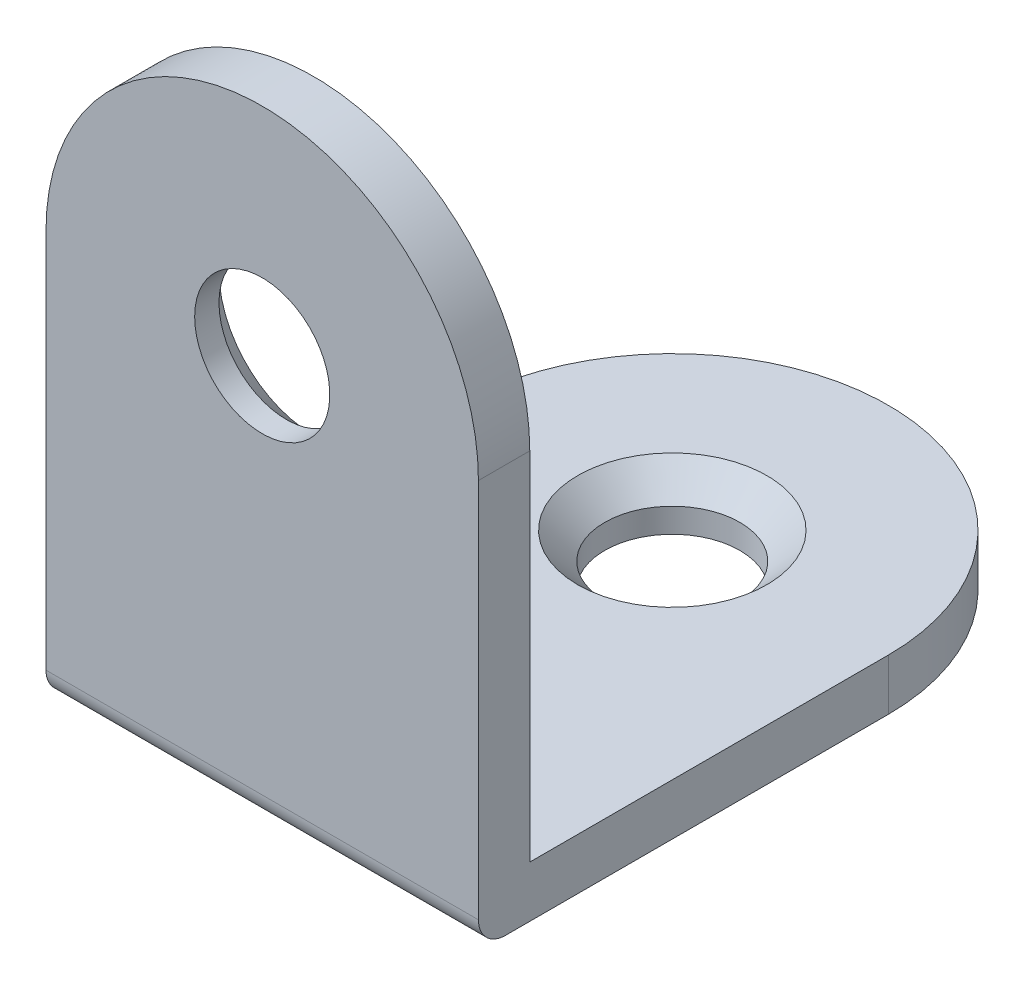
ISO-10303-21;
HEADER;
FILE_DESCRIPTION(('STEP AP214'),'2;1');
FILE_NAME('part.step','',(''),(''),'','','');
FILE_SCHEMA(('AUTOMOTIVE_DESIGN { 1 0 10303 214 1 1 1 1 }'));
ENDSEC;
DATA;
#1=APPLICATION_CONTEXT('core data for automotive mechanical design processes');
#2=APPLICATION_PROTOCOL_DEFINITION('international standard','automotive_design',2000,#1);
#3=PRODUCT_CONTEXT('',#1,'mechanical');
#4=PRODUCT('Part','Part','',(#3));
#5=PRODUCT_RELATED_PRODUCT_CATEGORY('part','',(#4));
#6=PRODUCT_DEFINITION_FORMATION('','',#4);
#7=PRODUCT_DEFINITION_CONTEXT('part definition',#1,'design');
#8=PRODUCT_DEFINITION('design','',#6,#7);
#9=PRODUCT_DEFINITION_SHAPE('','',#8);
#10=(LENGTH_UNIT() NAMED_UNIT(*) SI_UNIT(.MILLI.,.METRE.));
#11=(NAMED_UNIT(*) PLANE_ANGLE_UNIT() SI_UNIT($,.RADIAN.));
#12=(NAMED_UNIT(*) SI_UNIT($,.STERADIAN.) SOLID_ANGLE_UNIT());
#13=UNCERTAINTY_MEASURE_WITH_UNIT(LENGTH_MEASURE(1.E-05),#10,'distance_accuracy_value','');
#14=(GEOMETRIC_REPRESENTATION_CONTEXT(3) GLOBAL_UNCERTAINTY_ASSIGNED_CONTEXT((#13)) GLOBAL_UNIT_ASSIGNED_CONTEXT((#10,
#11,#12)) REPRESENTATION_CONTEXT('',''));
#15=CARTESIAN_POINT('',(0.,0.,0.));
#16=DIRECTION('',(0.,0.,1.));
#17=DIRECTION('',(1.,0.,0.));
#18=AXIS2_PLACEMENT_3D('',#15,#16,#17);
#19=CARTESIAN_POINT('',(16.,0.,1.9));
#20=DIRECTION('',(-1.,0.,0.));
#21=DIRECTION('',(0.,0.,1.));
#22=AXIS2_PLACEMENT_3D('',#19,#20,#21);
#23=PLANE('',#22);
#24=DIRECTION('',(0.,1.,0.));
#25=VECTOR('',#24,1.);
#26=CARTESIAN_POINT('',(16.,0.,1.9));
#27=LINE('',#26,#25);
#28=CARTESIAN_POINT('',(16.,1.,1.9));
#29=VERTEX_POINT('',#28);
#30=CARTESIAN_POINT('',(16.,15.0762690863172,1.9));
#31=VERTEX_POINT('',#30);
#32=EDGE_CURVE('E134',#29,#31,#27,.T.);
#33=ORIENTED_EDGE('',*,*,#32,.F.);
#34=CARTESIAN_POINT('',(16.,1.,0.9));
#35=DIRECTION('',(-1.,0.,0.));
#36=DIRECTION('',(0.,0.,1.));
#37=AXIS2_PLACEMENT_3D('',#34,#35,#36);
#38=CIRCLE('',#37,1.);
#39=CARTESIAN_POINT('',(16.,0.,0.9));
#40=VERTEX_POINT('',#39);
#41=EDGE_CURVE('E66',#29,#40,#38,.F.);
#42=ORIENTED_EDGE('',*,*,#41,.T.);
#43=DIRECTION('',(0.,0.,-1.));
#44=VECTOR('',#43,1.);
#45=CARTESIAN_POINT('',(16.,0.,1.9));
#46=LINE('',#45,#44);
#47=CARTESIAN_POINT('',(16.,0.,-13.2727143322964));
#48=VERTEX_POINT('',#47);
#49=EDGE_CURVE('E122',#40,#48,#46,.T.);
#50=ORIENTED_EDGE('',*,*,#49,.T.);
#51=DIRECTION('',(0.,-1.,0.));
#52=VECTOR('',#51,1.);
#53=CARTESIAN_POINT('',(16.,1.9,-13.2727143322964));
#54=LINE('',#53,#52);
#55=CARTESIAN_POINT('',(16.,1.9,-13.2727143322964));
#56=VERTEX_POINT('',#55);
#57=EDGE_CURVE('E116',#56,#48,#54,.T.);
#58=ORIENTED_EDGE('',*,*,#57,.F.);
#59=DIRECTION('',(0.,0.,-1.));
#60=VECTOR('',#59,1.);
#61=CARTESIAN_POINT('',(16.,1.9,1.9));
#62=LINE('',#61,#60);
#63=CARTESIAN_POINT('',(16.,1.9,0.));
#64=VERTEX_POINT('',#63);
#65=EDGE_CURVE('E101',#64,#56,#62,.T.);
#66=ORIENTED_EDGE('',*,*,#65,.F.);
#67=DIRECTION('',(0.,1.,0.));
#68=VECTOR('',#67,1.);
#69=CARTESIAN_POINT('',(16.,0.,0.));
#70=LINE('',#69,#68);
#71=CARTESIAN_POINT('',(16.,15.0762690863172,0.));
#72=VERTEX_POINT('',#71);
#73=EDGE_CURVE('E124',#64,#72,#70,.T.);
#74=ORIENTED_EDGE('',*,*,#73,.T.);
#75=DIRECTION('',(0.,0.,-1.));
#76=VECTOR('',#75,1.);
#77=CARTESIAN_POINT('',(16.,15.0762690863172,1.9));
#78=LINE('',#77,#76);
#79=EDGE_CURVE('E151',#31,#72,#78,.T.);
#80=ORIENTED_EDGE('',*,*,#79,.F.);
#81=EDGE_LOOP('',(#33,#42,#50,#58,#66,#74,#80));
#82=FACE_BOUND('',#81,.T.);
#83=ADVANCED_FACE('F42',(#82),#23,.F.);
#84=CARTESIAN_POINT('',(8.00000000000001,15.0762690863172,1.9));
#85=DIRECTION('',(0.,0.,-1.));
#86=DIRECTION('',(-1.,0.,0.));
#87=AXIS2_PLACEMENT_3D('',#84,#85,#86);
#88=CYLINDRICAL_SURFACE('',#87,8.);
#89=CARTESIAN_POINT('',(8.00000000000001,15.0762690863172,0.));
#90=DIRECTION('',(0.,0.,1.));
#91=DIRECTION('',(1.,0.,0.));
#92=AXIS2_PLACEMENT_3D('',#89,#90,#91);
#93=CIRCLE('',#92,8.);
#94=CARTESIAN_POINT('',(0.,15.0762690863172,0.));
#95=VERTEX_POINT('',#94);
#96=EDGE_CURVE('E126',#72,#95,#93,.T.);
#97=ORIENTED_EDGE('',*,*,#96,.T.);
#98=DIRECTION('',(0.,0.,-1.));
#99=VECTOR('',#98,1.);
#100=CARTESIAN_POINT('',(0.,15.0762690863172,1.9));
#101=LINE('',#100,#99);
#102=CARTESIAN_POINT('',(0.,15.0762690863172,1.9));
#103=VERTEX_POINT('',#102);
#104=EDGE_CURVE('E148',#103,#95,#101,.T.);
#105=ORIENTED_EDGE('',*,*,#104,.F.);
#106=CARTESIAN_POINT('',(8.00000000000001,15.0762690863172,1.9));
#107=DIRECTION('',(0.,0.,1.));
#108=DIRECTION('',(1.,0.,0.));
#109=AXIS2_PLACEMENT_3D('',#106,#107,#108);
#110=CIRCLE('',#109,8.);
#111=EDGE_CURVE('E137',#31,#103,#110,.T.);
#112=ORIENTED_EDGE('',*,*,#111,.F.);
#113=ORIENTED_EDGE('',*,*,#79,.T.);
#114=EDGE_LOOP('',(#97,#105,#112,#113));
#115=FACE_BOUND('',#114,.T.);
#116=ADVANCED_FACE('F183',(#115),#88,.T.);
#117=CARTESIAN_POINT('',(0.,0.,1.9));
#118=DIRECTION('',(1.,0.,0.));
#119=DIRECTION('',(0.,1.,0.));
#120=AXIS2_PLACEMENT_3D('',#117,#118,#119);
#121=PLANE('',#120);
#122=DIRECTION('',(0.,0.,-1.));
#123=VECTOR('',#122,1.);
#124=CARTESIAN_POINT('',(0.,0.,1.9));
#125=LINE('',#124,#123);
#126=CARTESIAN_POINT('',(0.,0.,0.9));
#127=VERTEX_POINT('',#126);
#128=CARTESIAN_POINT('',(0.,0.,-13.2727143322964));
#129=VERTEX_POINT('',#128);
#130=EDGE_CURVE('E146',#127,#129,#125,.T.);
#131=ORIENTED_EDGE('',*,*,#130,.F.);
#132=CARTESIAN_POINT('',(0.,1.,0.9));
#133=DIRECTION('',(1.,0.,0.));
#134=DIRECTION('',(0.,1.,0.));
#135=AXIS2_PLACEMENT_3D('',#132,#133,#134);
#136=CIRCLE('',#135,1.);
#137=CARTESIAN_POINT('',(0.,1.,1.9));
#138=VERTEX_POINT('',#137);
#139=EDGE_CURVE('E160',#127,#138,#136,.F.);
#140=ORIENTED_EDGE('',*,*,#139,.T.);
#141=DIRECTION('',(0.,-1.,0.));
#142=VECTOR('',#141,1.);
#143=CARTESIAN_POINT('',(0.,0.,1.9));
#144=LINE('',#143,#142);
#145=EDGE_CURVE('E139',#103,#138,#144,.T.);
#146=ORIENTED_EDGE('',*,*,#145,.F.);
#147=ORIENTED_EDGE('',*,*,#104,.T.);
#148=DIRECTION('',(0.,-1.,0.));
#149=VECTOR('',#148,1.);
#150=CARTESIAN_POINT('',(0.,0.,0.));
#151=LINE('',#150,#149);
#152=CARTESIAN_POINT('',(0.,1.9,0.));
#153=VERTEX_POINT('',#152);
#154=EDGE_CURVE('E135',#95,#153,#151,.T.);
#155=ORIENTED_EDGE('',*,*,#154,.T.);
#156=DIRECTION('',(0.,0.,1.));
#157=VECTOR('',#156,1.);
#158=CARTESIAN_POINT('',(0.,1.9,-13.2727143322964));
#159=LINE('',#158,#157);
#160=CARTESIAN_POINT('',(0.,1.9,-13.2727143322964));
#161=VERTEX_POINT('',#160);
#162=EDGE_CURVE('E120',#161,#153,#159,.T.);
#163=ORIENTED_EDGE('',*,*,#162,.F.);
#164=DIRECTION('',(0.,-1.,0.));
#165=VECTOR('',#164,1.);
#166=CARTESIAN_POINT('',(0.,1.9,-13.2727143322964));
#167=LINE('',#166,#165);
#168=EDGE_CURVE('E118',#161,#129,#167,.T.);
#169=ORIENTED_EDGE('',*,*,#168,.T.);
#170=EDGE_LOOP('',(#131,#140,#146,#147,#155,#163,#169));
#171=FACE_BOUND('',#170,.T.);
#172=ADVANCED_FACE('F190',(#171),#121,.F.);
#173=CARTESIAN_POINT('',(8.00000000000001,15.0762690863172,1.9));
#174=DIRECTION('',(0.,0.,-1.));
#175=DIRECTION('',(-1.,0.,0.));
#176=AXIS2_PLACEMENT_3D('',#173,#174,#175);
#177=CYLINDRICAL_SURFACE('',#176,2.5);
#178=CARTESIAN_POINT('',(8.00000000000001,15.0762690863172,0.999999999999994));
#179=DIRECTION('',(0.,0.,1.));
#180=DIRECTION('',(1.,0.,0.));
#181=AXIS2_PLACEMENT_3D('',#178,#179,#180);
#182=CIRCLE('',#181,2.5);
#183=CARTESIAN_POINT('',(5.50000000000001,15.0762690863172,0.999999999999994));
#184=VERTEX_POINT('',#183);
#185=EDGE_CURVE('E11',#184,#184,#182,.F.);
#186=CARTESIAN_POINT('',(8.00000000000001,15.0762690863172,1.9));
#187=DIRECTION('',(0.,0.,1.));
#188=DIRECTION('',(1.,0.,0.));
#189=AXIS2_PLACEMENT_3D('',#186,#187,#188);
#190=CIRCLE('',#189,2.5);
#191=CARTESIAN_POINT('',(5.50000000000001,15.0762690863172,1.9));
#192=VERTEX_POINT('',#191);
#193=EDGE_CURVE('E131',#192,#192,#190,.T.);
#194=CARTESIAN_POINT('',(5.50000000000001,15.0762690863172,0.999999999999994));
#195=CARTESIAN_POINT('',(5.50000000000001,15.0762690863172,1.00937499999999));
#196=CARTESIAN_POINT('',(5.50000000000001,15.0762690863172,1.01874999999999));
#197=CARTESIAN_POINT('',(5.50000000000001,15.0762690863172,1.03749999999999));
#198=CARTESIAN_POINT('',(5.50000000000001,15.0762690863172,1.04687499999999));
#199=CARTESIAN_POINT('',(5.50000000000001,15.0762690863172,1.06562499999999));
#200=CARTESIAN_POINT('',(5.50000000000001,15.0762690863172,1.07499999999999));
#201=CARTESIAN_POINT('',(5.50000000000001,15.0762690863172,1.09374999999999));
#202=CARTESIAN_POINT('',(5.50000000000001,15.0762690863172,1.10312499999999));
#203=CARTESIAN_POINT('',(5.50000000000001,15.0762690863172,1.12187499999999));
#204=CARTESIAN_POINT('',(5.50000000000001,15.0762690863172,1.13124999999999));
#205=CARTESIAN_POINT('',(5.50000000000001,15.0762690863172,1.14999999999999));
#206=CARTESIAN_POINT('',(5.50000000000001,15.0762690863172,1.15937499999999));
#207=CARTESIAN_POINT('',(5.50000000000001,15.0762690863172,1.17812499999999));
#208=CARTESIAN_POINT('',(5.50000000000001,15.0762690863172,1.18749999999999));
#209=CARTESIAN_POINT('',(5.50000000000001,15.0762690863172,1.20625));
#210=CARTESIAN_POINT('',(5.50000000000001,15.0762690863172,1.215625));
#211=CARTESIAN_POINT('',(5.50000000000001,15.0762690863172,1.234375));
#212=CARTESIAN_POINT('',(5.50000000000001,15.0762690863172,1.24375));
#213=CARTESIAN_POINT('',(5.50000000000001,15.0762690863172,1.2625));
#214=CARTESIAN_POINT('',(5.50000000000001,15.0762690863172,1.271875));
#215=CARTESIAN_POINT('',(5.50000000000001,15.0762690863172,1.290625));
#216=CARTESIAN_POINT('',(5.50000000000001,15.0762690863172,1.3));
#217=CARTESIAN_POINT('',(5.50000000000001,15.0762690863172,1.31875));
#218=CARTESIAN_POINT('',(5.50000000000001,15.0762690863172,1.328125));
#219=CARTESIAN_POINT('',(5.50000000000001,15.0762690863172,1.346875));
#220=CARTESIAN_POINT('',(5.50000000000001,15.0762690863172,1.35625));
#221=CARTESIAN_POINT('',(5.50000000000001,15.0762690863172,1.375));
#222=CARTESIAN_POINT('',(5.50000000000001,15.0762690863172,1.384375));
#223=CARTESIAN_POINT('',(5.50000000000001,15.0762690863172,1.403125));
#224=CARTESIAN_POINT('',(5.50000000000001,15.0762690863172,1.4125));
#225=CARTESIAN_POINT('',(5.50000000000001,15.0762690863172,1.43125));
#226=CARTESIAN_POINT('',(5.50000000000001,15.0762690863172,1.440625));
#227=CARTESIAN_POINT('',(5.50000000000001,15.0762690863172,1.459375));
#228=CARTESIAN_POINT('',(5.50000000000001,15.0762690863172,1.46875));
#229=CARTESIAN_POINT('',(5.50000000000001,15.0762690863172,1.4875));
#230=CARTESIAN_POINT('',(5.50000000000001,15.0762690863172,1.496875));
#231=CARTESIAN_POINT('',(5.50000000000001,15.0762690863172,1.515625));
#232=CARTESIAN_POINT('',(5.50000000000001,15.0762690863172,1.525));
#233=CARTESIAN_POINT('',(5.50000000000001,15.0762690863172,1.54375));
#234=CARTESIAN_POINT('',(5.50000000000001,15.0762690863172,1.553125));
#235=CARTESIAN_POINT('',(5.50000000000001,15.0762690863172,1.571875));
#236=CARTESIAN_POINT('',(5.50000000000001,15.0762690863172,1.58125));
#237=CARTESIAN_POINT('',(5.50000000000001,15.0762690863172,1.6));
#238=CARTESIAN_POINT('',(5.50000000000001,15.0762690863172,1.609375));
#239=CARTESIAN_POINT('',(5.50000000000001,15.0762690863172,1.628125));
#240=CARTESIAN_POINT('',(5.50000000000001,15.0762690863172,1.6375));
#241=CARTESIAN_POINT('',(5.50000000000001,15.0762690863172,1.65625));
#242=CARTESIAN_POINT('',(5.50000000000001,15.0762690863172,1.665625));
#243=CARTESIAN_POINT('',(5.50000000000001,15.0762690863172,1.684375));
#244=CARTESIAN_POINT('',(5.50000000000001,15.0762690863172,1.69375));
#245=CARTESIAN_POINT('',(5.50000000000001,15.0762690863172,1.7125));
#246=CARTESIAN_POINT('',(5.50000000000001,15.0762690863172,1.721875));
#247=CARTESIAN_POINT('',(5.50000000000001,15.0762690863172,1.740625));
#248=CARTESIAN_POINT('',(5.50000000000001,15.0762690863172,1.75));
#249=CARTESIAN_POINT('',(5.50000000000001,15.0762690863172,1.76875));
#250=CARTESIAN_POINT('',(5.50000000000001,15.0762690863172,1.778125));
#251=CARTESIAN_POINT('',(5.50000000000001,15.0762690863172,1.796875));
#252=CARTESIAN_POINT('',(5.50000000000001,15.0762690863172,1.80625));
#253=CARTESIAN_POINT('',(5.50000000000001,15.0762690863172,1.825));
#254=CARTESIAN_POINT('',(5.50000000000001,15.0762690863172,1.834375));
#255=CARTESIAN_POINT('',(5.50000000000001,15.0762690863172,1.853125));
#256=CARTESIAN_POINT('',(5.50000000000001,15.0762690863172,1.8625));
#257=CARTESIAN_POINT('',(5.50000000000001,15.0762690863172,1.88125));
#258=CARTESIAN_POINT('',(5.50000000000001,15.0762690863172,1.890625));
#259=CARTESIAN_POINT('',(5.50000000000001,15.0762690863172,1.9));
#260=B_SPLINE_CURVE_WITH_KNOTS('',3,(#194,#195,#196,#197,#198,#199,#200,#201,#202,#203,#204,
#205,#206,#207,#208,#209,#210,#211,#212,#213,#214,#215,#216,#217,#218,#219,#220,#221,#222,#223,
#224,#225,#226,#227,#228,#229,#230,#231,#232,#233,#234,#235,#236,#237,#238,#239,#240,#241,#242,
#243,#244,#245,#246,#247,#248,#249,#250,#251,#252,#253,#254,#255,#256,#257,#258,#259),
.UNSPECIFIED.,.F.,.F.,(4,2,2,2,2,2,2,2,2,2,2,2,2,2,2,2,2,2,2,2,2,2,2,2,2,2,2,2,2,2,2,2,4),(0.,
0.0281250000000004,0.0562500000000005,0.0843750000000007,0.112500000000001,0.140625000000001,
0.168750000000001,0.196875000000002,0.225000000000002,0.253125000000002,0.281250000000002,
0.309375000000002,0.337500000000003,0.365625000000003,0.393750000000003,0.421875000000003,
0.450000000000003,0.478125000000004,0.506250000000004,0.534375000000004,0.562500000000004,
0.590625000000004,0.618750000000004,0.646875000000005,0.675000000000005,0.703125000000005,
0.731250000000005,0.759375000000005,0.787500000000006,0.815625000000006,0.843750000000006,
0.871875000000006,0.900000000000006),.UNSPECIFIED.);
#261=EDGE_CURVE('BSEAM195',#184,#192,#260,.T.);
#262=ORIENTED_EDGE('',*,*,#185,.T.);
#263=ORIENTED_EDGE('',*,*,#193,.T.);
#264=ORIENTED_EDGE('',*,*,#261,.T.);
#265=ORIENTED_EDGE('',*,*,#261,.F.);
#266=EDGE_LOOP('',(#262,#264,#263,#265));
#267=FACE_BOUND('',#266,.T.);
#268=ADVANCED_FACE('F195',(#267),#177,.F.);
#269=CARTESIAN_POINT('',(0.,0.,1.9));
#270=DIRECTION('',(0.,1.,0.));
#271=DIRECTION('',(0.,0.,1.));
#272=AXIS2_PLACEMENT_3D('',#269,#270,#271);
#273=PLANE('',#272);
#274=ORIENTED_EDGE('',*,*,#49,.F.);
#275=DIRECTION('',(1.,0.,0.));
#276=VECTOR('',#275,1.);
#277=CARTESIAN_POINT('',(0.,0.,0.9));
#278=LINE('',#277,#276);
#279=EDGE_CURVE('E58',#40,#127,#278,.F.);
#280=ORIENTED_EDGE('',*,*,#279,.T.);
#281=ORIENTED_EDGE('',*,*,#130,.T.);
#282=CARTESIAN_POINT('',(7.99999999999997,0.,-13.2727143322964));
#283=DIRECTION('',(0.,1.,0.));
#284=DIRECTION('',(0.,0.,1.));
#285=AXIS2_PLACEMENT_3D('',#282,#283,#284);
#286=CIRCLE('',#285,8.00000000000003);
#287=EDGE_CURVE('E110',#48,#129,#286,.T.);
#288=ORIENTED_EDGE('',*,*,#287,.F.);
#289=EDGE_LOOP('',(#274,#280,#281,#288));
#290=FACE_BOUND('',#289,.T.);
#291=CARTESIAN_POINT('',(7.99999999999997,0.,-13.2727143322964));
#292=DIRECTION('',(0.,1.,0.));
#293=DIRECTION('',(0.,0.,1.));
#294=AXIS2_PLACEMENT_3D('',#291,#292,#293);
#295=CIRCLE('',#294,2.5);
#296=CARTESIAN_POINT('',(7.99999999999997,0.,-15.7727143322964));
#297=VERTEX_POINT('',#296);
#298=EDGE_CURVE('E319',#297,#297,#295,.T.);
#299=ORIENTED_EDGE('',*,*,#298,.T.);
#300=EDGE_LOOP('',(#299));
#301=FACE_BOUND('',#300,.T.);
#302=ADVANCED_FACE('F198',(#290,#301),#273,.F.);
#303=CARTESIAN_POINT('',(0.,0.,1.9));
#304=DIRECTION('',(0.,0.,1.));
#305=DIRECTION('',(1.,0.,0.));
#306=AXIS2_PLACEMENT_3D('',#303,#304,#305);
#307=PLANE('',#306);
#308=ORIENTED_EDGE('',*,*,#145,.T.);
#309=DIRECTION('',(1.,0.,0.));
#310=VECTOR('',#309,1.);
#311=CARTESIAN_POINT('',(16.,1.,1.9));
#312=LINE('',#311,#310);
#313=EDGE_CURVE('E155',#138,#29,#312,.T.);
#314=ORIENTED_EDGE('',*,*,#313,.T.);
#315=ORIENTED_EDGE('',*,*,#32,.T.);
#316=ORIENTED_EDGE('',*,*,#111,.T.);
#317=EDGE_LOOP('',(#308,#314,#315,#316));
#318=FACE_BOUND('',#317,.T.);
#319=ORIENTED_EDGE('',*,*,#193,.F.);
#320=EDGE_LOOP('',(#319));
#321=FACE_BOUND('',#320,.T.);
#322=ADVANCED_FACE('F219',(#318,#321),#307,.T.);
#323=CARTESIAN_POINT('',(0.,0.,0.));
#324=DIRECTION('',(0.,0.,1.));
#325=DIRECTION('',(1.,0.,0.));
#326=AXIS2_PLACEMENT_3D('',#323,#324,#325);
#327=PLANE('',#326);
#328=CARTESIAN_POINT('',(8.00000000000001,15.0762690863172,0.));
#329=DIRECTION('',(0.,0.,1.));
#330=DIRECTION('',(1.,0.,0.));
#331=AXIS2_PLACEMENT_3D('',#328,#329,#330);
#332=CIRCLE('',#331,3.49999999999999);
#333=CARTESIAN_POINT('',(11.5,15.0762690863172,0.));
#334=VERTEX_POINT('',#333);
#335=EDGE_CURVE('E51',#334,#334,#332,.T.);
#336=ORIENTED_EDGE('',*,*,#335,.T.);
#337=EDGE_LOOP('',(#336));
#338=FACE_BOUND('',#337,.T.);
#339=ORIENTED_EDGE('',*,*,#73,.F.);
#340=DIRECTION('',(-1.,0.,0.));
#341=VECTOR('',#340,1.);
#342=CARTESIAN_POINT('',(0.,1.9,0.));
#343=LINE('',#342,#341);
#344=EDGE_CURVE('E107',#64,#153,#343,.T.);
#345=ORIENTED_EDGE('',*,*,#344,.T.);
#346=ORIENTED_EDGE('',*,*,#154,.F.);
#347=ORIENTED_EDGE('',*,*,#96,.F.);
#348=EDGE_LOOP('',(#339,#345,#346,#347));
#349=FACE_BOUND('',#348,.T.);
#350=ADVANCED_FACE('F170',(#338,#349),#327,.F.);
#351=CARTESIAN_POINT('',(7.99999999999997,1.9,-13.2727143322964));
#352=DIRECTION('',(0.,1.,0.));
#353=DIRECTION('',(0.,0.,1.));
#354=AXIS2_PLACEMENT_3D('',#351,#352,#353);
#355=PLANE('',#354);
#356=CARTESIAN_POINT('',(7.99999999999997,1.9,-13.2727143322964));
#357=DIRECTION('',(0.,1.,0.));
#358=DIRECTION('',(0.,0.,1.));
#359=AXIS2_PLACEMENT_3D('',#356,#357,#358);
#360=CIRCLE('',#359,3.50000000000002);
#361=CARTESIAN_POINT('',(7.99999999999997,1.9,-9.77271433229639));
#362=VERTEX_POINT('',#361);
#363=EDGE_CURVE('E165',#362,#362,#360,.F.);
#364=ORIENTED_EDGE('',*,*,#363,.T.);
#365=EDGE_LOOP('',(#364));
#366=FACE_BOUND('',#365,.T.);
#367=ORIENTED_EDGE('',*,*,#344,.F.);
#368=ORIENTED_EDGE('',*,*,#65,.T.);
#369=CARTESIAN_POINT('',(7.99999999999997,1.9,-13.2727143322964));
#370=DIRECTION('',(0.,1.,0.));
#371=DIRECTION('',(0.,0.,1.));
#372=AXIS2_PLACEMENT_3D('',#369,#370,#371);
#373=CIRCLE('',#372,8.00000000000003);
#374=EDGE_CURVE('E104',#56,#161,#373,.T.);
#375=ORIENTED_EDGE('',*,*,#374,.T.);
#376=ORIENTED_EDGE('',*,*,#162,.T.);
#377=EDGE_LOOP('',(#367,#368,#375,#376));
#378=FACE_BOUND('',#377,.T.);
#379=ADVANCED_FACE('F103',(#366,#378),#355,.T.);
#380=CARTESIAN_POINT('',(7.99999999999997,1.9,-13.2727143322964));
#381=DIRECTION('',(0.,-1.,0.));
#382=DIRECTION('',(0.,0.,-1.));
#383=AXIS2_PLACEMENT_3D('',#380,#381,#382);
#384=CYLINDRICAL_SURFACE('',#383,8.00000000000003);
#385=ORIENTED_EDGE('',*,*,#287,.T.);
#386=ORIENTED_EDGE('',*,*,#168,.F.);
#387=ORIENTED_EDGE('',*,*,#374,.F.);
#388=ORIENTED_EDGE('',*,*,#57,.T.);
#389=EDGE_LOOP('',(#385,#386,#387,#388));
#390=FACE_BOUND('',#389,.T.);
#391=ADVANCED_FACE('F115',(#390),#384,.T.);
#392=CARTESIAN_POINT('',(7.99999999999997,1.9,-13.2727143322964));
#393=DIRECTION('',(0.,-1.,0.));
#394=DIRECTION('',(0.,0.,-1.));
#395=AXIS2_PLACEMENT_3D('',#392,#393,#394);
#396=CYLINDRICAL_SURFACE('',#395,2.5);
#397=CARTESIAN_POINT('',(7.99999999999997,0.899999999999986,-13.2727143322964));
#398=DIRECTION('',(0.,1.,0.));
#399=DIRECTION('',(0.,0.,1.));
#400=AXIS2_PLACEMENT_3D('',#397,#398,#399);
#401=CIRCLE('',#400,2.5);
#402=CARTESIAN_POINT('',(7.99999999999997,0.899999999999985,-15.7727143322964));
#403=VERTEX_POINT('',#402);
#404=EDGE_CURVE('E162',#403,#403,#401,.T.);
#405=CARTESIAN_POINT('',(7.99999999999997,0.899999999999985,-15.7727143322964));
#406=CARTESIAN_POINT('',(7.99999999999997,0.890624999999986,-15.7727143322964));
#407=CARTESIAN_POINT('',(7.99999999999997,0.881249999999986,-15.7727143322964));
#408=CARTESIAN_POINT('',(7.99999999999997,0.862499999999986,-15.7727143322964));
#409=CARTESIAN_POINT('',(7.99999999999997,0.853124999999986,-15.7727143322964));
#410=CARTESIAN_POINT('',(7.99999999999997,0.834374999999987,-15.7727143322964));
#411=CARTESIAN_POINT('',(7.99999999999997,0.824999999999987,-15.7727143322964));
#412=CARTESIAN_POINT('',(7.99999999999997,0.806249999999987,-15.7727143322964));
#413=CARTESIAN_POINT('',(7.99999999999997,0.796874999999987,-15.7727143322964));
#414=CARTESIAN_POINT('',(7.99999999999997,0.778124999999987,-15.7727143322964));
#415=CARTESIAN_POINT('',(7.99999999999997,0.768749999999987,-15.7727143322964));
#416=CARTESIAN_POINT('',(7.99999999999997,0.749999999999988,-15.7727143322964));
#417=CARTESIAN_POINT('',(7.99999999999997,0.740624999999988,-15.7727143322964));
#418=CARTESIAN_POINT('',(7.99999999999997,0.721874999999988,-15.7727143322964));
#419=CARTESIAN_POINT('',(7.99999999999997,0.712499999999989,-15.7727143322964));
#420=CARTESIAN_POINT('',(7.99999999999997,0.693749999999989,-15.7727143322964));
#421=CARTESIAN_POINT('',(7.99999999999997,0.684374999999989,-15.7727143322964));
#422=CARTESIAN_POINT('',(7.99999999999997,0.665624999999989,-15.7727143322964));
#423=CARTESIAN_POINT('',(7.99999999999997,0.656249999999989,-15.7727143322964));
#424=CARTESIAN_POINT('',(7.99999999999997,0.63749999999999,-15.7727143322964));
#425=CARTESIAN_POINT('',(7.99999999999997,0.62812499999999,-15.7727143322964));
#426=CARTESIAN_POINT('',(7.99999999999997,0.60937499999999,-15.7727143322964));
#427=CARTESIAN_POINT('',(7.99999999999997,0.59999999999999,-15.7727143322964));
#428=CARTESIAN_POINT('',(7.99999999999997,0.581249999999991,-15.7727143322964));
#429=CARTESIAN_POINT('',(7.99999999999997,0.571874999999991,-15.7727143322964));
#430=CARTESIAN_POINT('',(7.99999999999997,0.553124999999991,-15.7727143322964));
#431=CARTESIAN_POINT('',(7.99999999999997,0.543749999999991,-15.7727143322964));
#432=CARTESIAN_POINT('',(7.99999999999997,0.524999999999992,-15.7727143322964));
#433=CARTESIAN_POINT('',(7.99999999999997,0.515624999999992,-15.7727143322964));
#434=CARTESIAN_POINT('',(7.99999999999997,0.496874999999992,-15.7727143322964));
#435=CARTESIAN_POINT('',(7.99999999999997,0.487499999999992,-15.7727143322964));
#436=CARTESIAN_POINT('',(7.99999999999997,0.468749999999992,-15.7727143322964));
#437=CARTESIAN_POINT('',(7.99999999999997,0.459374999999993,-15.7727143322964));
#438=CARTESIAN_POINT('',(7.99999999999997,0.440624999999993,-15.7727143322964));
#439=CARTESIAN_POINT('',(7.99999999999997,0.431249999999993,-15.7727143322964));
#440=CARTESIAN_POINT('',(7.99999999999997,0.412499999999993,-15.7727143322964));
#441=CARTESIAN_POINT('',(7.99999999999997,0.403124999999993,-15.7727143322964));
#442=CARTESIAN_POINT('',(7.99999999999997,0.384374999999994,-15.7727143322964));
#443=CARTESIAN_POINT('',(7.99999999999997,0.374999999999994,-15.7727143322964));
#444=CARTESIAN_POINT('',(7.99999999999997,0.356249999999994,-15.7727143322964));
#445=CARTESIAN_POINT('',(7.99999999999997,0.346874999999994,-15.7727143322964));
#446=CARTESIAN_POINT('',(7.99999999999997,0.328124999999995,-15.7727143322964));
#447=CARTESIAN_POINT('',(7.99999999999997,0.318749999999995,-15.7727143322964));
#448=CARTESIAN_POINT('',(7.99999999999997,0.299999999999995,-15.7727143322964));
#449=CARTESIAN_POINT('',(7.99999999999997,0.290624999999995,-15.7727143322964));
#450=CARTESIAN_POINT('',(7.99999999999997,0.271874999999996,-15.7727143322964));
#451=CARTESIAN_POINT('',(7.99999999999997,0.262499999999996,-15.7727143322964));
#452=CARTESIAN_POINT('',(7.99999999999997,0.243749999999996,-15.7727143322964));
#453=CARTESIAN_POINT('',(7.99999999999997,0.234374999999996,-15.7727143322964));
#454=CARTESIAN_POINT('',(7.99999999999997,0.215624999999997,-15.7727143322964));
#455=CARTESIAN_POINT('',(7.99999999999997,0.206249999999997,-15.7727143322964));
#456=CARTESIAN_POINT('',(7.99999999999997,0.187499999999997,-15.7727143322964));
#457=CARTESIAN_POINT('',(7.99999999999997,0.178124999999997,-15.7727143322964));
#458=CARTESIAN_POINT('',(7.99999999999997,0.159374999999997,-15.7727143322964));
#459=CARTESIAN_POINT('',(7.99999999999997,0.149999999999998,-15.7727143322964));
#460=CARTESIAN_POINT('',(7.99999999999997,0.131249999999998,-15.7727143322964));
#461=CARTESIAN_POINT('',(7.99999999999997,0.121874999999998,-15.7727143322964));
#462=CARTESIAN_POINT('',(7.99999999999997,0.103124999999998,-15.7727143322964));
#463=CARTESIAN_POINT('',(7.99999999999997,0.0937499999999984,-15.7727143322964));
#464=CARTESIAN_POINT('',(7.99999999999997,0.0749999999999987,-15.7727143322964));
#465=CARTESIAN_POINT('',(7.99999999999997,0.0656249999999989,-15.7727143322964));
#466=CARTESIAN_POINT('',(7.99999999999997,0.0468749999999992,-15.7727143322964));
#467=CARTESIAN_POINT('',(7.99999999999997,0.0374999999999993,-15.7727143322964));
#468=CARTESIAN_POINT('',(7.99999999999997,0.0187499999999997,-15.7727143322964));
#469=CARTESIAN_POINT('',(7.99999999999997,0.00937499999999982,-15.7727143322964));
#470=CARTESIAN_POINT('',(7.99999999999997,0.,-15.7727143322964));
#471=B_SPLINE_CURVE_WITH_KNOTS('',3,(#405,#406,#407,#408,#409,#410,#411,#412,#413,#414,#415,
#416,#417,#418,#419,#420,#421,#422,#423,#424,#425,#426,#427,#428,#429,#430,#431,#432,#433,#434,
#435,#436,#437,#438,#439,#440,#441,#442,#443,#444,#445,#446,#447,#448,#449,#450,#451,#452,#453,
#454,#455,#456,#457,#458,#459,#460,#461,#462,#463,#464,#465,#466,#467,#468,#469,#470),
.UNSPECIFIED.,.F.,.F.,(4,2,2,2,2,2,2,2,2,2,2,2,2,2,2,2,2,2,2,2,2,2,2,2,2,2,2,2,2,2,2,2,4),(0.,
0.0281249999999995,0.056249999999999,0.0843749999999987,0.112499999999998,0.140624999999998,
0.168749999999997,0.196874999999997,0.224999999999996,0.253124999999996,0.281249999999996,
0.309374999999995,0.337499999999994,0.365624999999994,0.393749999999993,0.421874999999993,
0.449999999999993,0.478124999999992,0.506249999999992,0.534374999999991,0.562499999999991,
0.59062499999999,0.61874999999999,0.646874999999989,0.674999999999989,0.703124999999988,
0.731249999999988,0.759374999999988,0.787499999999987,0.815624999999987,0.843749999999986,
0.871874999999986,0.899999999999985),.UNSPECIFIED.);
#472=EDGE_CURVE('BSEAM201',#403,#297,#471,.T.);
#473=ORIENTED_EDGE('',*,*,#404,.T.);
#474=ORIENTED_EDGE('',*,*,#298,.F.);
#475=ORIENTED_EDGE('',*,*,#472,.T.);
#476=ORIENTED_EDGE('',*,*,#472,.F.);
#477=EDGE_LOOP('',(#473,#475,#474,#476));
#478=FACE_BOUND('',#477,.T.);
#479=ADVANCED_FACE('F201',(#478),#396,.F.);
#480=CARTESIAN_POINT('',(0.,1.,0.9));
#481=DIRECTION('',(-1.,0.,0.));
#482=DIRECTION('',(0.,0.,1.));
#483=AXIS2_PLACEMENT_3D('',#480,#481,#482);
#484=CYLINDRICAL_SURFACE('',#483,1.);
#485=ORIENTED_EDGE('',*,*,#139,.F.);
#486=ORIENTED_EDGE('',*,*,#279,.F.);
#487=ORIENTED_EDGE('',*,*,#41,.F.);
#488=ORIENTED_EDGE('',*,*,#313,.F.);
#489=EDGE_LOOP('',(#485,#486,#487,#488));
#490=FACE_BOUND('',#489,.T.);
#491=ADVANCED_FACE('F179',(#490),#484,.T.);
#492=CARTESIAN_POINT('',(7.99999999999997,0.899999999999986,-13.2727143322964));
#493=DIRECTION('',(0.,1.,0.));
#494=DIRECTION('',(0.,0.,1.));
#495=AXIS2_PLACEMENT_3D('',#492,#493,#494);
#496=CONICAL_SURFACE('',#495,2.5,0.785398163397449);
#497=ORIENTED_EDGE('',*,*,#363,.F.);
#498=EDGE_LOOP('',(#497));
#499=FACE_BOUND('',#498,.T.);
#500=ORIENTED_EDGE('',*,*,#404,.F.);
#501=EDGE_LOOP('',(#500));
#502=FACE_BOUND('',#501,.T.);
#503=ADVANCED_FACE('F174',(#499,#502),#496,.F.);
#504=CARTESIAN_POINT('',(8.00000000000001,15.0762690863172,0.));
#505=DIRECTION('',(0.,0.,-1.));
#506=DIRECTION('',(-1.,0.,0.));
#507=AXIS2_PLACEMENT_3D('',#504,#505,#506);
#508=CONICAL_SURFACE('',#507,3.49999999999999,0.785398163397448);
#509=ORIENTED_EDGE('',*,*,#185,.F.);
#510=EDGE_LOOP('',(#509));
#511=FACE_BOUND('',#510,.T.);
#512=ORIENTED_EDGE('',*,*,#335,.F.);
#513=EDGE_LOOP('',(#512));
#514=FACE_BOUND('',#513,.T.);
#515=ADVANCED_FACE('F45',(#511,#514),#508,.F.);
#516=CLOSED_SHELL('',(#83,#116,#172,#268,#302,#322,#350,#379,#391,#479,#491,#503,#515));
#517=MANIFOLD_SOLID_BREP('B2',#516);
#518=ADVANCED_BREP_SHAPE_REPRESENTATION('',(#18,#517),#14);
#519=SHAPE_DEFINITION_REPRESENTATION(#9,#518);
ENDSEC;
END-ISO-10303-21;
